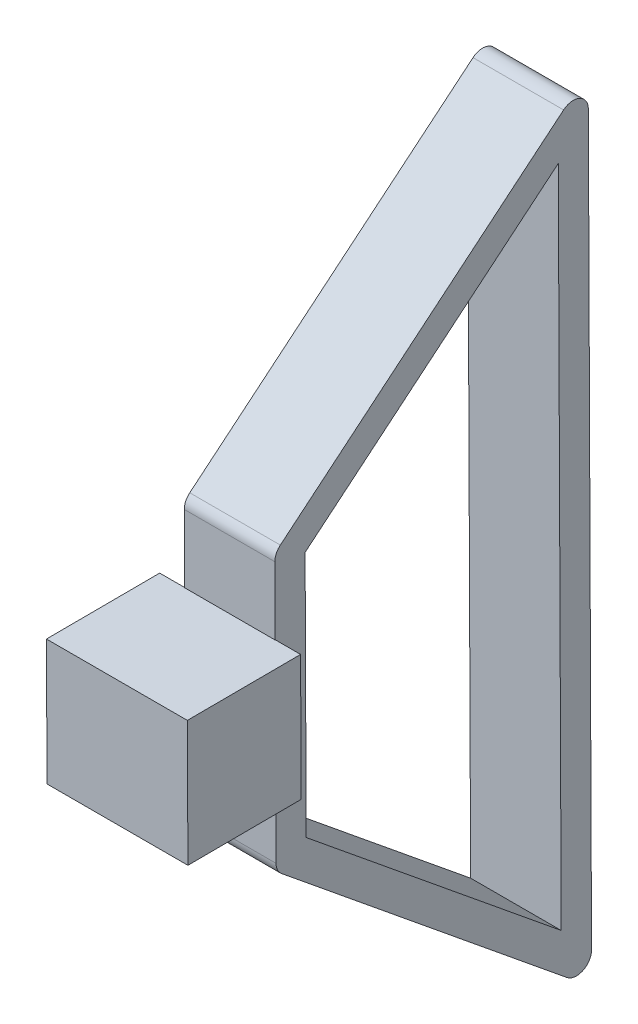
ISO-10303-21;
HEADER;
FILE_DESCRIPTION(('STEP AP214'),'2;1');
FILE_NAME('part.step','',(''),(''),'','','');
FILE_SCHEMA(('AUTOMOTIVE_DESIGN { 1 0 10303 214 1 1 1 1 }'));
ENDSEC;
DATA;
#1=APPLICATION_CONTEXT('core data for automotive mechanical design processes');
#2=APPLICATION_PROTOCOL_DEFINITION('international standard','automotive_design',2000,#1);
#3=PRODUCT_CONTEXT('',#1,'mechanical');
#4=PRODUCT('Part','Part','',(#3));
#5=PRODUCT_RELATED_PRODUCT_CATEGORY('part','',(#4));
#6=PRODUCT_DEFINITION_FORMATION('','',#4);
#7=PRODUCT_DEFINITION_CONTEXT('part definition',#1,'design');
#8=PRODUCT_DEFINITION('design','',#6,#7);
#9=PRODUCT_DEFINITION_SHAPE('','',#8);
#10=(LENGTH_UNIT() NAMED_UNIT(*) SI_UNIT(.MILLI.,.METRE.));
#11=(NAMED_UNIT(*) PLANE_ANGLE_UNIT() SI_UNIT($,.RADIAN.));
#12=(NAMED_UNIT(*) SI_UNIT($,.STERADIAN.) SOLID_ANGLE_UNIT());
#13=UNCERTAINTY_MEASURE_WITH_UNIT(LENGTH_MEASURE(1.E-05),#10,'distance_accuracy_value','');
#14=(GEOMETRIC_REPRESENTATION_CONTEXT(3) GLOBAL_UNCERTAINTY_ASSIGNED_CONTEXT((#13)) GLOBAL_UNIT_ASSIGNED_CONTEXT((#10,
#11,#12)) REPRESENTATION_CONTEXT('',''));
#15=CARTESIAN_POINT('',(0.,0.,0.));
#16=DIRECTION('',(0.,0.,1.));
#17=DIRECTION('',(1.,0.,0.));
#18=AXIS2_PLACEMENT_3D('',#15,#16,#17);
#19=CARTESIAN_POINT('',(53.3,-0.172777997477,39.338415366267));
#20=DIRECTION('',(-1.,0.,0.));
#21=DIRECTION('',(0.,0.,1.));
#22=AXIS2_PLACEMENT_3D('',#19,#20,#21);
#23=PLANE('',#22);
#24=DIRECTION('',(0.,0.00439205111356597,-0.999990354896994));
#25=VECTOR('',#24,1.);
#26=CARTESIAN_POINT('',(53.3,2.31731577476,41.599373792569));
#27=LINE('',#26,#25);
#28=CARTESIAN_POINT('',(53.3,2.31731577476,41.599373792569));
#29=VERTEX_POINT('',#28);
#30=CARTESIAN_POINT('',(53.3,2.337080004771,37.099417195533));
#31=VERTEX_POINT('',#30);
#32=EDGE_CURVE('E395',#29,#31,#27,.T.);
#33=ORIENTED_EDGE('',*,*,#32,.F.);
#34=DIRECTION('',(0.,0.999990354896994,0.00439205111356697));
#35=VECTOR('',#34,1.);
#36=CARTESIAN_POINT('',(53.3,-2.682635999725,41.577413537001));
#37=LINE('',#36,#35);
#38=CARTESIAN_POINT('',(53.3,-2.682635999725,41.577413537001));
#39=VERTEX_POINT('',#38);
#40=EDGE_CURVE('E25',#39,#29,#37,.T.);
#41=ORIENTED_EDGE('',*,*,#40,.F.);
#42=DIRECTION('',(0.,-0.00439205111356597,0.999990354896994));
#43=VECTOR('',#42,1.);
#44=CARTESIAN_POINT('',(53.3,-2.662871769714,37.077456939965));
#45=LINE('',#44,#43);
#46=CARTESIAN_POINT('',(53.3,-2.662871769714,37.077456939965));
#47=VERTEX_POINT('',#46);
#48=EDGE_CURVE('E76',#47,#39,#45,.T.);
#49=ORIENTED_EDGE('',*,*,#48,.F.);
#50=DIRECTION('',(0.,-0.999990354896994,-0.00439205111356697));
#51=VECTOR('',#50,1.);
#52=CARTESIAN_POINT('',(53.3,2.337080004771,37.099417195533));
#53=LINE('',#52,#51);
#54=EDGE_CURVE('E285',#31,#47,#53,.T.);
#55=ORIENTED_EDGE('',*,*,#54,.F.);
#56=EDGE_LOOP('',(#33,#41,#49,#55));
#57=FACE_BOUND('',#56,.T.);
#58=ADVANCED_FACE('F14',(#57),#23,.F.);
#59=CARTESIAN_POINT('',(47.7,-0.172777997477,39.338415366267));
#60=DIRECTION('',(-1.,0.,0.));
#61=DIRECTION('',(0.,0.,1.));
#62=AXIS2_PLACEMENT_3D('',#59,#60,#61);
#63=PLANE('',#62);
#64=DIRECTION('',(0.,-0.999990354896994,-0.00439205111356697));
#65=VECTOR('',#64,1.);
#66=CARTESIAN_POINT('',(47.7,2.337080004771,37.099417195533));
#67=LINE('',#66,#65);
#68=CARTESIAN_POINT('',(47.7,2.337080004771,37.099417195533));
#69=VERTEX_POINT('',#68);
#70=CARTESIAN_POINT('',(47.7,-2.662871769714,37.077456939965));
#71=VERTEX_POINT('',#70);
#72=EDGE_CURVE('E39',#69,#71,#67,.T.);
#73=ORIENTED_EDGE('',*,*,#72,.T.);
#74=DIRECTION('',(0.,-0.00439205111356597,0.999990354896994));
#75=VECTOR('',#74,1.);
#76=CARTESIAN_POINT('',(47.7,-2.662871769714,37.077456939965));
#77=LINE('',#76,#75);
#78=CARTESIAN_POINT('',(47.7,-2.682635999725,41.577413537001));
#79=VERTEX_POINT('',#78);
#80=EDGE_CURVE('E259',#71,#79,#77,.T.);
#81=ORIENTED_EDGE('',*,*,#80,.T.);
#82=DIRECTION('',(0.,0.999990354896994,0.00439205111356697));
#83=VECTOR('',#82,1.);
#84=CARTESIAN_POINT('',(47.7,-2.682635999725,41.577413537001));
#85=LINE('',#84,#83);
#86=CARTESIAN_POINT('',(47.7,2.31731577476,41.599373792569));
#87=VERTEX_POINT('',#86);
#88=EDGE_CURVE('E9',#79,#87,#85,.T.);
#89=ORIENTED_EDGE('',*,*,#88,.T.);
#90=DIRECTION('',(0.,0.00439205111356597,-0.999990354896994));
#91=VECTOR('',#90,1.);
#92=CARTESIAN_POINT('',(47.7,2.31731577476,41.599373792569));
#93=LINE('',#92,#91);
#94=EDGE_CURVE('E282',#87,#69,#93,.T.);
#95=ORIENTED_EDGE('',*,*,#94,.T.);
#96=EDGE_LOOP('',(#73,#81,#89,#95));
#97=FACE_BOUND('',#96,.T.);
#98=ADVANCED_FACE('F461',(#97),#63,.T.);
#99=CARTESIAN_POINT('',(50.5,-2.682635999725,41.577413537001));
#100=DIRECTION('',(0.,-0.00439205111356697,0.999990354896994));
#101=DIRECTION('',(-1.,0.,0.));
#102=AXIS2_PLACEMENT_3D('',#99,#100,#101);
#103=PLANE('',#102);
#104=DIRECTION('',(-1.,0.,0.));
#105=VECTOR('',#104,1.);
#106=CARTESIAN_POINT('',(53.3,-2.682635999725,41.577413537001));
#107=LINE('',#106,#105);
#108=EDGE_CURVE('E255',#39,#79,#107,.T.);
#109=ORIENTED_EDGE('',*,*,#108,.F.);
#110=ORIENTED_EDGE('',*,*,#40,.T.);
#111=DIRECTION('',(1.,0.,0.));
#112=VECTOR('',#111,1.);
#113=CARTESIAN_POINT('',(47.7,2.31731577476,41.599373792569));
#114=LINE('',#113,#112);
#115=EDGE_CURVE('E251',#87,#29,#114,.T.);
#116=ORIENTED_EDGE('',*,*,#115,.F.);
#117=ORIENTED_EDGE('',*,*,#88,.F.);
#118=EDGE_LOOP('',(#109,#110,#116,#117));
#119=FACE_BOUND('',#118,.T.);
#120=ADVANCED_FACE('F466',(#119),#103,.T.);
#121=CARTESIAN_POINT('',(50.5,2.337080004771,37.099417195533));
#122=DIRECTION('',(0.,0.00439205111356697,-0.999990354896994));
#123=DIRECTION('',(-1.,0.,0.));
#124=AXIS2_PLACEMENT_3D('',#121,#122,#123);
#125=PLANE('',#124);
#126=DIRECTION('',(1.,0.,0.));
#127=VECTOR('',#126,1.);
#128=CARTESIAN_POINT('',(47.7,2.337080004771,37.099417195533));
#129=LINE('',#128,#127);
#130=CARTESIAN_POINT('',(48.7,2.337080004771,37.099417195533));
#131=VERTEX_POINT('',#130);
#132=EDGE_CURVE('E286',#69,#131,#129,.T.);
#133=ORIENTED_EDGE('',*,*,#132,.T.);
#134=DIRECTION('',(0.,-0.999990354896994,-0.00439205111356697));
#135=VECTOR('',#134,1.);
#136=CARTESIAN_POINT('',(48.7,1.08709206115,37.093927131641));
#137=LINE('',#136,#135);
#138=CARTESIAN_POINT('',(48.7,-2.662871769714,37.077456939965));
#139=VERTEX_POINT('',#138);
#140=EDGE_CURVE('E313',#131,#139,#137,.T.);
#141=ORIENTED_EDGE('',*,*,#140,.T.);
#142=DIRECTION('',(-1.,0.,0.));
#143=VECTOR('',#142,1.);
#144=CARTESIAN_POINT('',(53.3,-2.662871769714,37.077456939965));
#145=LINE('',#144,#143);
#146=EDGE_CURVE('E256',#139,#71,#145,.T.);
#147=ORIENTED_EDGE('',*,*,#146,.T.);
#148=ORIENTED_EDGE('',*,*,#72,.F.);
#149=EDGE_LOOP('',(#133,#141,#147,#148));
#150=FACE_BOUND('',#149,.T.);
#151=ADVANCED_FACE('F488',(#150),#125,.T.);
#152=CARTESIAN_POINT('',(50.5,-5.07622784985,35.876845776687));
#153=DIRECTION('',(0.,-0.00439205111356597,0.999990354896994));
#154=DIRECTION('',(-1.,0.,0.));
#155=AXIS2_PLACEMENT_3D('',#152,#153,#154);
#156=PLANE('',#155);
#157=DIRECTION('',(1.,0.,0.));
#158=VECTOR('',#157,1.);
#159=CARTESIAN_POINT('',(48.7,-5.07622784985,35.876845776687));
#160=LINE('',#159,#158);
#161=CARTESIAN_POINT('',(48.7,-5.07622784985,35.876845776687));
#162=VERTEX_POINT('',#161);
#163=CARTESIAN_POINT('',(52.3,-5.07622784985,35.876845776687));
#164=VERTEX_POINT('',#163);
#165=EDGE_CURVE('E373',#162,#164,#160,.T.);
#166=ORIENTED_EDGE('',*,*,#165,.F.);
#167=DIRECTION('',(0.,0.999990354896994,0.00439205111356597));
#168=VECTOR('',#167,1.);
#169=CARTESIAN_POINT('',(48.7,-5.359511025567,35.875601570499));
#170=LINE('',#169,#168);
#171=CARTESIAN_POINT('',(48.7,4.760889166557,35.920051314155));
#172=VERTEX_POINT('',#171);
#173=EDGE_CURVE('E383',#162,#172,#170,.T.);
#174=ORIENTED_EDGE('',*,*,#173,.T.);
#175=DIRECTION('',(1.,0.,0.));
#176=VECTOR('',#175,1.);
#177=CARTESIAN_POINT('',(48.7,4.760889166557,35.920051314155));
#178=LINE('',#177,#176);
#179=CARTESIAN_POINT('',(52.3,4.760889166557,35.920051314155));
#180=VERTEX_POINT('',#179);
#181=EDGE_CURVE('E247',#172,#180,#178,.T.);
#182=ORIENTED_EDGE('',*,*,#181,.T.);
#183=DIRECTION('',(0.,0.999990354896994,0.00439205111356597));
#184=VECTOR('',#183,1.);
#185=CARTESIAN_POINT('',(52.3,-5.359511025567,35.875601570499));
#186=LINE('',#185,#184);
#187=EDGE_CURVE('E264',#164,#180,#186,.T.);
#188=ORIENTED_EDGE('',*,*,#187,.F.);
#189=EDGE_LOOP('',(#166,#174,#182,#188));
#190=FACE_BOUND('',#189,.T.);
#191=ADVANCED_FACE('F486',(#190),#156,.F.);
#192=CARTESIAN_POINT('',(50.5,-13.34238637547,25.741647837907));
#193=DIRECTION('',(0.,-0.774941013792996,0.632033563302997));
#194=DIRECTION('',(-1.,0.,0.));
#195=AXIS2_PLACEMENT_3D('',#192,#193,#194);
#196=PLANE('',#195);
#197=DIRECTION('',(1.,0.,0.));
#198=VECTOR('',#197,1.);
#199=CARTESIAN_POINT('',(48.7,-13.34238637547,25.741647837907));
#200=LINE('',#199,#198);
#201=CARTESIAN_POINT('',(48.7,-13.34238637547,25.741647837907));
#202=VERTEX_POINT('',#201);
#203=CARTESIAN_POINT('',(52.3,-13.34238637547,25.741647837907));
#204=VERTEX_POINT('',#203);
#205=EDGE_CURVE('E370',#202,#204,#200,.T.);
#206=ORIENTED_EDGE('',*,*,#205,.F.);
#207=DIRECTION('',(0.,0.632033563302997,0.774941013792996));
#208=VECTOR('',#207,1.);
#209=CARTESIAN_POINT('',(48.7,-14.14557522579,24.756852064276));
#210=LINE('',#209,#208);
#211=EDGE_CURVE('E376',#202,#162,#210,.T.);
#212=ORIENTED_EDGE('',*,*,#211,.T.);
#213=ORIENTED_EDGE('',*,*,#165,.T.);
#214=DIRECTION('',(0.,0.632033563302997,0.774941013792996));
#215=VECTOR('',#214,1.);
#216=CARTESIAN_POINT('',(52.3,-14.14557522579,24.756852064276));
#217=LINE('',#216,#215);
#218=EDGE_CURVE('E260',#204,#164,#217,.T.);
#219=ORIENTED_EDGE('',*,*,#218,.F.);
#220=EDGE_LOOP('',(#206,#212,#213,#219));
#221=FACE_BOUND('',#220,.T.);
#222=ADVANCED_FACE('F16',(#221),#196,.F.);
#223=CARTESIAN_POINT('',(50.5,4.760889166557,35.920051314155));
#224=DIRECTION('',(0.,0.76935932251115,0.638816274734125));
#225=DIRECTION('',(1.,0.,0.));
#226=AXIS2_PLACEMENT_3D('',#223,#224,#225);
#227=PLANE('',#226);
#228=ORIENTED_EDGE('',*,*,#181,.F.);
#229=DIRECTION('',(0.,0.638816274734125,-0.76935932251115));
#230=VECTOR('',#229,1.);
#231=CARTESIAN_POINT('',(48.7,4.579921518099,36.137999968441));
#232=LINE('',#231,#230);
#233=CARTESIAN_POINT('',(48.7,13.115756538014,25.857854474778));
#234=VERTEX_POINT('',#233);
#235=EDGE_CURVE('E402',#172,#234,#232,.T.);
#236=ORIENTED_EDGE('',*,*,#235,.T.);
#237=DIRECTION('',(-1.,0.,0.));
#238=VECTOR('',#237,1.);
#239=CARTESIAN_POINT('',(52.3,13.115756538014,25.857854474778));
#240=LINE('',#239,#238);
#241=CARTESIAN_POINT('',(52.3,13.115756538014,25.857854474778));
#242=VERTEX_POINT('',#241);
#243=EDGE_CURVE('E367',#242,#234,#240,.T.);
#244=ORIENTED_EDGE('',*,*,#243,.F.);
#245=DIRECTION('',(0.,0.638816274734125,-0.76935932251115));
#246=VECTOR('',#245,1.);
#247=CARTESIAN_POINT('',(52.3,4.579921518099,36.137999968441));
#248=LINE('',#247,#246);
#249=EDGE_CURVE('E277',#180,#242,#248,.T.);
#250=ORIENTED_EDGE('',*,*,#249,.F.);
#251=EDGE_LOOP('',(#228,#236,#244,#250));
#252=FACE_BOUND('',#251,.T.);
#253=ADVANCED_FACE('F494',(#252),#227,.F.);
#254=CARTESIAN_POINT('',(50.5,13.115756538014,25.857854474778));
#255=DIRECTION('',(0.,0.00439205111356597,-0.999990354896994));
#256=DIRECTION('',(-1.,0.,0.));
#257=AXIS2_PLACEMENT_3D('',#254,#255,#256);
#258=PLANE('',#257);
#259=DIRECTION('',(0.,-0.999990354896994,-0.00439205111356597));
#260=VECTOR('',#259,1.);
#261=CARTESIAN_POINT('',(48.7,14.386545227276,25.863435897489));
#262=LINE('',#261,#260);
#263=EDGE_CURVE('E18',#234,#202,#262,.T.);
#264=ORIENTED_EDGE('',*,*,#263,.T.);
#265=ORIENTED_EDGE('',*,*,#205,.T.);
#266=DIRECTION('',(0.,-0.999990354896994,-0.00439205111356597));
#267=VECTOR('',#266,1.);
#268=CARTESIAN_POINT('',(52.3,14.386545227276,25.863435897489));
#269=LINE('',#268,#267);
#270=EDGE_CURVE('E280',#242,#204,#269,.T.);
#271=ORIENTED_EDGE('',*,*,#270,.F.);
#272=ORIENTED_EDGE('',*,*,#243,.T.);
#273=EDGE_LOOP('',(#264,#265,#271,#272));
#274=FACE_BOUND('',#273,.T.);
#275=ADVANCED_FACE('F481',(#274),#258,.F.);
#276=CARTESIAN_POINT('',(50.5,-15.07550444234,25.515292340239));
#277=DIRECTION('',(0.,-0.774941013792996,0.632033563302997));
#278=DIRECTION('',(-1.,0.,0.));
#279=AXIS2_PLACEMENT_3D('',#276,#277,#278);
#280=PLANE('',#279);
#281=DIRECTION('',(-1.,0.,0.));
#282=VECTOR('',#281,1.);
#283=CARTESIAN_POINT('',(52.3,-15.07550444234,25.515292340239));
#284=LINE('',#283,#282);
#285=CARTESIAN_POINT('',(52.3,-15.07550444234,25.515292340239));
#286=VERTEX_POINT('',#285);
#287=CARTESIAN_POINT('',(48.7,-15.07550444234,25.515292340239));
#288=VERTEX_POINT('',#287);
#289=EDGE_CURVE('E374',#286,#288,#284,.T.);
#290=ORIENTED_EDGE('',*,*,#289,.F.);
#291=DIRECTION('',(0.,0.632033563302997,0.774941013792996));
#292=VECTOR('',#291,1.);
#293=CARTESIAN_POINT('',(52.3,-15.07550444234,25.515292340239));
#294=LINE('',#293,#292);
#295=CARTESIAN_POINT('',(52.3,-5.827110864511,36.854815921419));
#296=VERTEX_POINT('',#295);
#297=EDGE_CURVE('E325',#286,#296,#294,.T.);
#298=ORIENTED_EDGE('',*,*,#297,.T.);
#299=DIRECTION('',(-1.,0.,0.));
#300=VECTOR('',#299,1.);
#301=CARTESIAN_POINT('',(52.3,-5.827110864511,36.854815921419));
#302=LINE('',#301,#300);
#303=CARTESIAN_POINT('',(48.7,-5.827110864511,36.854815921419));
#304=VERTEX_POINT('',#303);
#305=EDGE_CURVE('E222',#296,#304,#302,.T.);
#306=ORIENTED_EDGE('',*,*,#305,.T.);
#307=DIRECTION('',(0.,0.632033563302997,0.774941013792996));
#308=VECTOR('',#307,1.);
#309=CARTESIAN_POINT('',(48.7,-15.07550444234,25.515292340239));
#310=LINE('',#309,#308);
#311=EDGE_CURVE('E236',#288,#304,#310,.T.);
#312=ORIENTED_EDGE('',*,*,#311,.F.);
#313=EDGE_LOOP('',(#290,#298,#306,#312));
#314=FACE_BOUND('',#313,.T.);
#315=ADVANCED_FACE('F479',(#314),#280,.T.);
#316=CARTESIAN_POINT('',(50.5,-5.362146256235,36.475595783438));
#317=DIRECTION('',(-1.,0.,0.));
#318=DIRECTION('',(0.,0.999990354896994,0.00439205111356597));
#319=AXIS2_PLACEMENT_3D('',#316,#317,#318);
#320=CYLINDRICAL_SURFACE('',#319,0.6);
#321=DIRECTION('',(1.,0.,0.));
#322=VECTOR('',#321,1.);
#323=CARTESIAN_POINT('',(48.7,-5.364781486903,37.075589996376));
#324=LINE('',#323,#322);
#325=CARTESIAN_POINT('',(48.7,-5.364781486903,37.075589996376));
#326=VERTEX_POINT('',#325);
#327=CARTESIAN_POINT('',(52.3,-5.364781486903,37.075589996376));
#328=VERTEX_POINT('',#327);
#329=EDGE_CURVE('E213',#326,#328,#324,.T.);
#330=ORIENTED_EDGE('',*,*,#329,.F.);
#331=CARTESIAN_POINT('',(48.7,-5.362146256235,36.475595783438));
#332=DIRECTION('',(1.,0.,0.));
#333=DIRECTION('',(0.,0.999990354896994,0.00439205111356597));
#334=AXIS2_PLACEMENT_3D('',#331,#332,#333);
#335=CIRCLE('',#334,0.6);
#336=EDGE_CURVE('E216',#326,#304,#335,.T.);
#337=ORIENTED_EDGE('',*,*,#336,.T.);
#338=ORIENTED_EDGE('',*,*,#305,.F.);
#339=CARTESIAN_POINT('',(52.3,-5.362146256235,36.475595783438));
#340=DIRECTION('',(1.,0.,0.));
#341=DIRECTION('',(0.,0.999990354896994,0.00439205111356597));
#342=AXIS2_PLACEMENT_3D('',#339,#340,#341);
#343=CIRCLE('',#342,0.6);
#344=EDGE_CURVE('E219',#328,#296,#343,.T.);
#345=ORIENTED_EDGE('',*,*,#344,.F.);
#346=EDGE_LOOP('',(#330,#337,#338,#345));
#347=FACE_BOUND('',#346,.T.);
#348=ADVANCED_FACE('F214',(#347),#320,.T.);
#349=CARTESIAN_POINT('',(50.5,-5.364781486903,37.075589996376));
#350=DIRECTION('',(0.,-0.00439205111356597,0.999990354896994));
#351=DIRECTION('',(-1.,0.,0.));
#352=AXIS2_PLACEMENT_3D('',#349,#350,#351);
#353=PLANE('',#352);
#354=ORIENTED_EDGE('',*,*,#329,.T.);
#355=DIRECTION('',(0.,0.999990354896994,0.00439205111356597));
#356=VECTOR('',#355,1.);
#357=CARTESIAN_POINT('',(52.3,-5.364781486903,37.075589996376));
#358=LINE('',#357,#356);
#359=CARTESIAN_POINT('',(52.3,-2.662915690225,37.087456843514));
#360=VERTEX_POINT('',#359);
#361=EDGE_CURVE('E326',#328,#360,#358,.T.);
#362=ORIENTED_EDGE('',*,*,#361,.T.);
#363=DIRECTION('',(1.,0.,0.));
#364=VECTOR('',#363,1.);
#365=CARTESIAN_POINT('',(50.5,-2.662915690225,37.087456843514));
#366=LINE('',#365,#364);
#367=CARTESIAN_POINT('',(48.7,-2.662915690225,37.087456843514));
#368=VERTEX_POINT('',#367);
#369=EDGE_CURVE('E124',#368,#360,#366,.T.);
#370=ORIENTED_EDGE('',*,*,#369,.F.);
#371=DIRECTION('',(0.,0.999990354896994,0.00439205111356597));
#372=VECTOR('',#371,1.);
#373=CARTESIAN_POINT('',(48.7,-5.364781486903,37.075589996376));
#374=LINE('',#373,#372);
#375=EDGE_CURVE('E225',#326,#368,#374,.T.);
#376=ORIENTED_EDGE('',*,*,#375,.F.);
#377=EDGE_LOOP('',(#354,#362,#370,#376));
#378=FACE_BOUND('',#377,.T.);
#379=ADVANCED_FACE('F226',(#378),#353,.T.);
#380=CARTESIAN_POINT('',(50.5,-2.662871769714,37.077456939965));
#381=DIRECTION('',(0.,-0.999990354896994,-0.00439205111356597));
#382=DIRECTION('',(0.,0.00439205111356597,-0.999990354896994));
#383=AXIS2_PLACEMENT_3D('',#380,#381,#382);
#384=PLANE('',#383);
#385=DIRECTION('',(-1.,0.,0.));
#386=VECTOR('',#385,1.);
#387=CARTESIAN_POINT('',(53.3,-2.662871769714,37.077456939965));
#388=LINE('',#387,#386);
#389=CARTESIAN_POINT('',(52.3,-2.662871769714,37.077456939965));
#390=VERTEX_POINT('',#389);
#391=EDGE_CURVE('E135',#47,#390,#388,.T.);
#392=ORIENTED_EDGE('',*,*,#391,.F.);
#393=ORIENTED_EDGE('',*,*,#48,.T.);
#394=ORIENTED_EDGE('',*,*,#108,.T.);
#395=ORIENTED_EDGE('',*,*,#80,.F.);
#396=ORIENTED_EDGE('',*,*,#146,.F.);
#397=DIRECTION('',(0.,-0.00439205111356597,0.999990354896994));
#398=VECTOR('',#397,1.);
#399=CARTESIAN_POINT('',(48.7,-2.645810185849,33.192843837145));
#400=LINE('',#399,#398);
#401=EDGE_CURVE('E230',#139,#368,#400,.T.);
#402=ORIENTED_EDGE('',*,*,#401,.T.);
#403=ORIENTED_EDGE('',*,*,#369,.T.);
#404=DIRECTION('',(0.,-0.00439205111356597,0.999990354896994));
#405=VECTOR('',#404,1.);
#406=CARTESIAN_POINT('',(52.3,-2.645810185849,33.192843837145));
#407=LINE('',#406,#405);
#408=EDGE_CURVE('E365',#390,#360,#407,.T.);
#409=ORIENTED_EDGE('',*,*,#408,.F.);
#410=EDGE_LOOP('',(#392,#393,#394,#395,#396,#402,#403,#409));
#411=FACE_BOUND('',#410,.T.);
#412=ADVANCED_FACE('F449',(#411),#384,.T.);
#413=CARTESIAN_POINT('',(50.5,2.337080004771,37.099417195533));
#414=DIRECTION('',(0.,0.00439205111356697,-0.999990354896994));
#415=DIRECTION('',(-1.,0.,0.));
#416=AXIS2_PLACEMENT_3D('',#413,#414,#415);
#417=PLANE('',#416);
#418=DIRECTION('',(1.,0.,0.));
#419=VECTOR('',#418,1.);
#420=CARTESIAN_POINT('',(47.7,2.337080004771,37.099417195533));
#421=LINE('',#420,#419);
#422=CARTESIAN_POINT('',(52.3,2.337080004771,37.099417195533));
#423=VERTEX_POINT('',#422);
#424=EDGE_CURVE('E309',#423,#31,#421,.T.);
#425=ORIENTED_EDGE('',*,*,#424,.T.);
#426=ORIENTED_EDGE('',*,*,#54,.T.);
#427=ORIENTED_EDGE('',*,*,#391,.T.);
#428=DIRECTION('',(0.,-0.999990354896994,-0.00439205111356697));
#429=VECTOR('',#428,1.);
#430=CARTESIAN_POINT('',(52.3,1.08709206115,37.093927131641));
#431=LINE('',#430,#429);
#432=EDGE_CURVE('E362',#423,#390,#431,.T.);
#433=ORIENTED_EDGE('',*,*,#432,.F.);
#434=EDGE_LOOP('',(#425,#426,#427,#433));
#435=FACE_BOUND('',#434,.T.);
#436=ADVANCED_FACE('F447',(#435),#417,.T.);
#437=CARTESIAN_POINT('',(50.5,2.31731577476,41.599373792569));
#438=DIRECTION('',(0.,0.999990354896994,0.00439205111356597));
#439=DIRECTION('',(1.,0.,0.));
#440=AXIS2_PLACEMENT_3D('',#437,#438,#439);
#441=PLANE('',#440);
#442=ORIENTED_EDGE('',*,*,#115,.T.);
#443=ORIENTED_EDGE('',*,*,#32,.T.);
#444=ORIENTED_EDGE('',*,*,#424,.F.);
#445=DIRECTION('',(0.,0.00439205111356597,-0.999990354896994));
#446=VECTOR('',#445,1.);
#447=CARTESIAN_POINT('',(52.3,2.34425947363,35.464782391231));
#448=LINE('',#447,#446);
#449=CARTESIAN_POINT('',(52.3,2.33703608426,37.109417099082));
#450=VERTEX_POINT('',#449);
#451=EDGE_CURVE('E366',#450,#423,#448,.T.);
#452=ORIENTED_EDGE('',*,*,#451,.F.);
#453=DIRECTION('',(-1.,0.,0.));
#454=VECTOR('',#453,1.);
#455=CARTESIAN_POINT('',(50.5,2.33703608426,37.109417099082));
#456=LINE('',#455,#454);
#457=CARTESIAN_POINT('',(48.7,2.33703608426,37.109417099082));
#458=VERTEX_POINT('',#457);
#459=EDGE_CURVE('E249',#450,#458,#456,.T.);
#460=ORIENTED_EDGE('',*,*,#459,.T.);
#461=DIRECTION('',(0.,0.00439205111356597,-0.999990354896994));
#462=VECTOR('',#461,1.);
#463=CARTESIAN_POINT('',(48.7,2.34425947363,35.464782391231));
#464=LINE('',#463,#462);
#465=EDGE_CURVE('E292',#458,#131,#464,.T.);
#466=ORIENTED_EDGE('',*,*,#465,.T.);
#467=ORIENTED_EDGE('',*,*,#132,.F.);
#468=ORIENTED_EDGE('',*,*,#94,.F.);
#469=EDGE_LOOP('',(#442,#443,#444,#452,#460,#466,#467,#468));
#470=FACE_BOUND('',#469,.T.);
#471=ADVANCED_FACE('F445',(#470),#441,.T.);
#472=CARTESIAN_POINT('',(50.5,-5.364781486903,37.075589996376));
#473=DIRECTION('',(0.,-0.00439205111356597,0.999990354896994));
#474=DIRECTION('',(-1.,0.,0.));
#475=AXIS2_PLACEMENT_3D('',#472,#473,#474);
#476=PLANE('',#475);
#477=ORIENTED_EDGE('',*,*,#459,.F.);
#478=DIRECTION('',(0.,0.999990354896994,0.00439205111356597));
#479=VECTOR('',#478,1.);
#480=CARTESIAN_POINT('',(52.3,-5.364781486903,37.075589996376));
#481=LINE('',#480,#479);
#482=CARTESIAN_POINT('',(52.3,5.038901880938,37.12128394622));
#483=VERTEX_POINT('',#482);
#484=EDGE_CURVE('E300',#450,#483,#481,.T.);
#485=ORIENTED_EDGE('',*,*,#484,.T.);
#486=DIRECTION('',(1.,0.,0.));
#487=VECTOR('',#486,1.);
#488=CARTESIAN_POINT('',(48.7,5.038901880938,37.12128394622));
#489=LINE('',#488,#487);
#490=CARTESIAN_POINT('',(48.7,5.038901880938,37.12128394622));
#491=VERTEX_POINT('',#490);
#492=EDGE_CURVE('E252',#491,#483,#489,.T.);
#493=ORIENTED_EDGE('',*,*,#492,.F.);
#494=DIRECTION('',(0.,0.999990354896994,0.00439205111356597));
#495=VECTOR('',#494,1.);
#496=CARTESIAN_POINT('',(48.7,-5.364781486903,37.075589996376));
#497=LINE('',#496,#495);
#498=EDGE_CURVE('E287',#458,#491,#497,.T.);
#499=ORIENTED_EDGE('',*,*,#498,.F.);
#500=EDGE_LOOP('',(#477,#485,#493,#499));
#501=FACE_BOUND('',#500,.T.);
#502=ADVANCED_FACE('F456',(#501),#476,.T.);
#503=CARTESIAN_POINT('',(50.5,5.041537111606,36.521289733281));
#504=DIRECTION('',(-1.,0.,0.));
#505=DIRECTION('',(0.,0.638816274734125,-0.76935932251115));
#506=AXIS2_PLACEMENT_3D('',#503,#504,#505);
#507=CYLINDRICAL_SURFACE('',#506,0.6);
#508=DIRECTION('',(1.,0.,0.));
#509=VECTOR('',#508,1.);
#510=CARTESIAN_POINT('',(48.7,5.503152705112,36.904579498122));
#511=LINE('',#510,#509);
#512=CARTESIAN_POINT('',(48.7,5.503152705112,36.904579498122));
#513=VERTEX_POINT('',#512);
#514=CARTESIAN_POINT('',(52.3,5.503152705112,36.904579498122));
#515=VERTEX_POINT('',#514);
#516=EDGE_CURVE('E305',#513,#515,#511,.T.);
#517=ORIENTED_EDGE('',*,*,#516,.F.);
#518=CARTESIAN_POINT('',(48.7,5.041537111606,36.521289733281));
#519=DIRECTION('',(1.,0.,0.));
#520=DIRECTION('',(0.,0.638816274734125,-0.76935932251115));
#521=AXIS2_PLACEMENT_3D('',#518,#519,#520);
#522=CIRCLE('',#521,0.6);
#523=EDGE_CURVE('E291',#513,#491,#522,.T.);
#524=ORIENTED_EDGE('',*,*,#523,.T.);
#525=ORIENTED_EDGE('',*,*,#492,.T.);
#526=CARTESIAN_POINT('',(52.3,5.041537111606,36.521289733281));
#527=DIRECTION('',(1.,0.,0.));
#528=DIRECTION('',(0.,0.638816274734125,-0.76935932251115));
#529=AXIS2_PLACEMENT_3D('',#526,#527,#528);
#530=CIRCLE('',#529,0.6);
#531=EDGE_CURVE('E296',#515,#483,#530,.T.);
#532=ORIENTED_EDGE('',*,*,#531,.F.);
#533=EDGE_LOOP('',(#517,#524,#525,#532));
#534=FACE_BOUND('',#533,.T.);
#535=ADVANCED_FACE('F472',(#534),#507,.T.);
#536=CARTESIAN_POINT('',(50.5,-14.61053983406,25.136072202258));
#537=DIRECTION('',(-1.,0.,0.));
#538=DIRECTION('',(0.,0.632033563302997,0.774941013792996));
#539=AXIS2_PLACEMENT_3D('',#536,#537,#538);
#540=CYLINDRICAL_SURFACE('',#539,0.6);
#541=CARTESIAN_POINT('',(48.7,-14.61053983406,25.136072202258));
#542=DIRECTION('',(1.,0.,0.));
#543=DIRECTION('',(0.,0.632033563302997,0.774941013792996));
#544=AXIS2_PLACEMENT_3D('',#541,#542,#543);
#545=CIRCLE('',#544,0.6);
#546=CARTESIAN_POINT('',(48.7,-14.6079046034,24.536077989319));
#547=VERTEX_POINT('',#546);
#548=EDGE_CURVE('E243',#288,#547,#545,.T.);
#549=ORIENTED_EDGE('',*,*,#548,.T.);
#550=DIRECTION('',(-1.,0.,0.));
#551=VECTOR('',#550,1.);
#552=CARTESIAN_POINT('',(52.3,-14.6079046034,24.536077989319));
#553=LINE('',#552,#551);
#554=CARTESIAN_POINT('',(52.3,-14.6079046034,24.536077989319));
#555=VERTEX_POINT('',#554);
#556=EDGE_CURVE('E271',#555,#547,#553,.T.);
#557=ORIENTED_EDGE('',*,*,#556,.F.);
#558=CARTESIAN_POINT('',(52.3,-14.61053983406,25.136072202258));
#559=DIRECTION('',(1.,0.,0.));
#560=DIRECTION('',(0.,0.632033563302997,0.774941013792996));
#561=AXIS2_PLACEMENT_3D('',#558,#559,#560);
#562=CIRCLE('',#561,0.6);
#563=EDGE_CURVE('E265',#286,#555,#562,.T.);
#564=ORIENTED_EDGE('',*,*,#563,.F.);
#565=ORIENTED_EDGE('',*,*,#289,.T.);
#566=EDGE_LOOP('',(#549,#557,#564,#565));
#567=FACE_BOUND('',#566,.T.);
#568=ADVANCED_FACE('F469',(#567),#540,.T.);
#569=CARTESIAN_POINT('',(48.7,-0.128772714742,29.31921086211));
#570=DIRECTION('',(-1.,0.,0.));
#571=DIRECTION('',(0.,0.,1.));
#572=AXIS2_PLACEMENT_3D('',#569,#570,#571);
#573=PLANE('',#572);
#574=ORIENTED_EDGE('',*,*,#263,.F.);
#575=ORIENTED_EDGE('',*,*,#235,.F.);
#576=ORIENTED_EDGE('',*,*,#173,.F.);
#577=ORIENTED_EDGE('',*,*,#211,.F.);
#578=EDGE_LOOP('',(#574,#575,#576,#577));
#579=FACE_BOUND('',#578,.T.);
#580=CARTESIAN_POINT('',(48.7,14.389180457945,25.263441684551));
#581=DIRECTION('',(1.,0.,0.));
#582=DIRECTION('',(0.,-0.999990354896994,-0.00439205111356597));
#583=AXIS2_PLACEMENT_3D('',#580,#581,#582);
#584=CIRCLE('',#583,0.6);
#585=CARTESIAN_POINT('',(48.7,14.391815688613,24.663447471613));
#586=VERTEX_POINT('',#585);
#587=CARTESIAN_POINT('',(48.7,14.850796051451,25.646731449391));
#588=VERTEX_POINT('',#587);
#589=EDGE_CURVE('E319',#586,#588,#584,.T.);
#590=ORIENTED_EDGE('',*,*,#589,.F.);
#591=DIRECTION('',(0.,-0.999990354896994,-0.00439205111356597));
#592=VECTOR('',#591,1.);
#593=CARTESIAN_POINT('',(48.7,14.391815688613,24.663447471613));
#594=LINE('',#593,#592);
#595=EDGE_CURVE('E266',#586,#547,#594,.T.);
#596=ORIENTED_EDGE('',*,*,#595,.T.);
#597=ORIENTED_EDGE('',*,*,#548,.F.);
#598=ORIENTED_EDGE('',*,*,#311,.T.);
#599=ORIENTED_EDGE('',*,*,#336,.F.);
#600=ORIENTED_EDGE('',*,*,#375,.T.);
#601=ORIENTED_EDGE('',*,*,#401,.F.);
#602=ORIENTED_EDGE('',*,*,#140,.F.);
#603=ORIENTED_EDGE('',*,*,#465,.F.);
#604=ORIENTED_EDGE('',*,*,#498,.T.);
#605=ORIENTED_EDGE('',*,*,#523,.F.);
#606=DIRECTION('',(0.,0.638816274734125,-0.76935932251115));
#607=VECTOR('',#606,1.);
#608=CARTESIAN_POINT('',(48.7,5.503152705112,36.904579498122));
#609=LINE('',#608,#607);
#610=EDGE_CURVE('E322',#513,#588,#609,.T.);
#611=ORIENTED_EDGE('',*,*,#610,.T.);
#612=EDGE_LOOP('',(#590,#596,#597,#598,#599,#600,#601,#602,#603,#604,#605,#611));
#613=FACE_BOUND('',#612,.T.);
#614=ADVANCED_FACE('F233',(#579,#613),#573,.T.);
#615=CARTESIAN_POINT('',(50.5,5.503152705112,36.904579498122));
#616=DIRECTION('',(0.,0.76935932251115,0.638816274734125));
#617=DIRECTION('',(1.,0.,0.));
#618=AXIS2_PLACEMENT_3D('',#615,#616,#617);
#619=PLANE('',#618);
#620=DIRECTION('',(0.,0.638816274734125,-0.76935932251115));
#621=VECTOR('',#620,1.);
#622=CARTESIAN_POINT('',(52.3,5.503152705112,36.904579498122));
#623=LINE('',#622,#621);
#624=CARTESIAN_POINT('',(52.3,14.850796051451,25.646731449391));
#625=VERTEX_POINT('',#624);
#626=EDGE_CURVE('E270',#515,#625,#623,.T.);
#627=ORIENTED_EDGE('',*,*,#626,.T.);
#628=DIRECTION('',(1.,0.,0.));
#629=VECTOR('',#628,1.);
#630=CARTESIAN_POINT('',(48.7,14.850796051451,25.646731449391));
#631=LINE('',#630,#629);
#632=EDGE_CURVE('E314',#588,#625,#631,.T.);
#633=ORIENTED_EDGE('',*,*,#632,.F.);
#634=ORIENTED_EDGE('',*,*,#610,.F.);
#635=ORIENTED_EDGE('',*,*,#516,.T.);
#636=EDGE_LOOP('',(#627,#633,#634,#635));
#637=FACE_BOUND('',#636,.T.);
#638=ADVANCED_FACE('F348',(#637),#619,.T.);
#639=CARTESIAN_POINT('',(52.3,-0.128772714742,29.31921086211));
#640=DIRECTION('',(-1.,0.,0.));
#641=DIRECTION('',(0.,0.,1.));
#642=AXIS2_PLACEMENT_3D('',#639,#640,#641);
#643=PLANE('',#642);
#644=ORIENTED_EDGE('',*,*,#218,.T.);
#645=ORIENTED_EDGE('',*,*,#187,.T.);
#646=ORIENTED_EDGE('',*,*,#249,.T.);
#647=ORIENTED_EDGE('',*,*,#270,.T.);
#648=EDGE_LOOP('',(#644,#645,#646,#647));
#649=FACE_BOUND('',#648,.T.);
#650=ORIENTED_EDGE('',*,*,#626,.F.);
#651=ORIENTED_EDGE('',*,*,#531,.T.);
#652=ORIENTED_EDGE('',*,*,#484,.F.);
#653=ORIENTED_EDGE('',*,*,#451,.T.);
#654=ORIENTED_EDGE('',*,*,#432,.T.);
#655=ORIENTED_EDGE('',*,*,#408,.T.);
#656=ORIENTED_EDGE('',*,*,#361,.F.);
#657=ORIENTED_EDGE('',*,*,#344,.T.);
#658=ORIENTED_EDGE('',*,*,#297,.F.);
#659=ORIENTED_EDGE('',*,*,#563,.T.);
#660=DIRECTION('',(0.,-0.999990354896994,-0.00439205111356597));
#661=VECTOR('',#660,1.);
#662=CARTESIAN_POINT('',(52.3,14.391815688613,24.663447471613));
#663=LINE('',#662,#661);
#664=CARTESIAN_POINT('',(52.3,14.391815688613,24.663447471613));
#665=VERTEX_POINT('',#664);
#666=EDGE_CURVE('E272',#665,#555,#663,.T.);
#667=ORIENTED_EDGE('',*,*,#666,.F.);
#668=CARTESIAN_POINT('',(52.3,14.389180457945,25.263441684551));
#669=DIRECTION('',(1.,0.,0.));
#670=DIRECTION('',(0.,-0.999990354896994,-0.00439205111356597));
#671=AXIS2_PLACEMENT_3D('',#668,#669,#670);
#672=CIRCLE('',#671,0.6);
#673=EDGE_CURVE('E318',#665,#625,#672,.T.);
#674=ORIENTED_EDGE('',*,*,#673,.T.);
#675=EDGE_LOOP('',(#650,#651,#652,#653,#654,#655,#656,#657,#658,#659,#667,#674));
#676=FACE_BOUND('',#675,.T.);
#677=ADVANCED_FACE('F354',(#649,#676),#643,.F.);
#678=CARTESIAN_POINT('',(50.5,14.391815688613,24.663447471613));
#679=DIRECTION('',(0.,0.00439205111356597,-0.999990354896994));
#680=DIRECTION('',(-1.,0.,0.));
#681=AXIS2_PLACEMENT_3D('',#678,#679,#680);
#682=PLANE('',#681);
#683=DIRECTION('',(-1.,0.,0.));
#684=VECTOR('',#683,1.);
#685=CARTESIAN_POINT('',(52.3,14.391815688613,24.663447471613));
#686=LINE('',#685,#684);
#687=EDGE_CURVE('E276',#665,#586,#686,.T.);
#688=ORIENTED_EDGE('',*,*,#687,.F.);
#689=ORIENTED_EDGE('',*,*,#666,.T.);
#690=ORIENTED_EDGE('',*,*,#556,.T.);
#691=ORIENTED_EDGE('',*,*,#595,.F.);
#692=EDGE_LOOP('',(#688,#689,#690,#691));
#693=FACE_BOUND('',#692,.T.);
#694=ADVANCED_FACE('F476',(#693),#682,.T.);
#695=CARTESIAN_POINT('',(50.5,14.389180457945,25.263441684551));
#696=DIRECTION('',(-1.,0.,0.));
#697=DIRECTION('',(0.,-0.999990354896994,-0.00439205111356597));
#698=AXIS2_PLACEMENT_3D('',#695,#696,#697);
#699=CYLINDRICAL_SURFACE('',#698,0.6);
#700=ORIENTED_EDGE('',*,*,#589,.T.);
#701=ORIENTED_EDGE('',*,*,#632,.T.);
#702=ORIENTED_EDGE('',*,*,#673,.F.);
#703=ORIENTED_EDGE('',*,*,#687,.T.);
#704=EDGE_LOOP('',(#700,#701,#702,#703));
#705=FACE_BOUND('',#704,.T.);
#706=ADVANCED_FACE('F340',(#705),#699,.T.);
#707=CLOSED_SHELL('',(#58,#98,#120,#151,#191,#222,#253,#275,#315,#348,#379,#412,#436,#471,#502,
#535,#568,#614,#638,#677,#694,#706));
#708=MANIFOLD_SOLID_BREP('B1',#707);
#709=ADVANCED_BREP_SHAPE_REPRESENTATION('',(#18,#708),#14);
#710=SHAPE_DEFINITION_REPRESENTATION(#9,#709);
ENDSEC;
END-ISO-10303-21;
